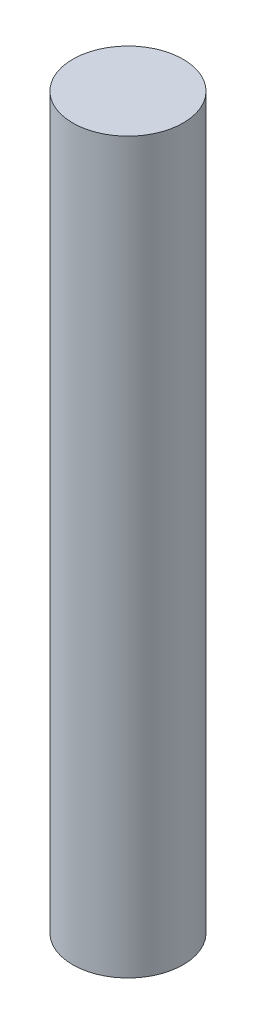
ISO-10303-21;
HEADER;
FILE_DESCRIPTION(('STEP AP214'),'2;1');
FILE_NAME('part.step','',(''),(''),'','','');
FILE_SCHEMA(('AUTOMOTIVE_DESIGN { 1 0 10303 214 1 1 1 1 }'));
ENDSEC;
DATA;
#1=APPLICATION_CONTEXT('core data for automotive mechanical design processes');
#2=APPLICATION_PROTOCOL_DEFINITION('international standard','automotive_design',2000,#1);
#3=PRODUCT_CONTEXT('',#1,'mechanical');
#4=PRODUCT('Part','Part','',(#3));
#5=PRODUCT_RELATED_PRODUCT_CATEGORY('part','',(#4));
#6=PRODUCT_DEFINITION_FORMATION('','',#4);
#7=PRODUCT_DEFINITION_CONTEXT('part definition',#1,'design');
#8=PRODUCT_DEFINITION('design','',#6,#7);
#9=PRODUCT_DEFINITION_SHAPE('','',#8);
#10=(LENGTH_UNIT() NAMED_UNIT(*) SI_UNIT(.MILLI.,.METRE.));
#11=(NAMED_UNIT(*) PLANE_ANGLE_UNIT() SI_UNIT($,.RADIAN.));
#12=(NAMED_UNIT(*) SI_UNIT($,.STERADIAN.) SOLID_ANGLE_UNIT());
#13=UNCERTAINTY_MEASURE_WITH_UNIT(LENGTH_MEASURE(1.E-05),#10,'distance_accuracy_value','');
#14=(GEOMETRIC_REPRESENTATION_CONTEXT(3) GLOBAL_UNCERTAINTY_ASSIGNED_CONTEXT((#13)) GLOBAL_UNIT_ASSIGNED_CONTEXT((#10,
#11,#12)) REPRESENTATION_CONTEXT('',''));
#15=CARTESIAN_POINT('',(0.,0.,0.));
#16=DIRECTION('',(0.,0.,1.));
#17=DIRECTION('',(1.,0.,0.));
#18=AXIS2_PLACEMENT_3D('',#15,#16,#17);
#19=CARTESIAN_POINT('',(0.,330.,0.));
#20=DIRECTION('',(0.,-1.,0.));
#21=DIRECTION('',(0.,0.,-1.));
#22=AXIS2_PLACEMENT_3D('',#19,#20,#21);
#23=CYLINDRICAL_SURFACE('',#22,25.);
#24=CARTESIAN_POINT('',(0.,330.,0.));
#25=DIRECTION('',(0.,1.,0.));
#26=DIRECTION('',(0.,0.,1.));
#27=AXIS2_PLACEMENT_3D('',#24,#25,#26);
#28=CIRCLE('',#27,25.);
#29=CARTESIAN_POINT('',(0.,330.,25.));
#30=VERTEX_POINT('',#29);
#31=EDGE_CURVE('E10',#30,#30,#28,.T.);
#32=ORIENTED_EDGE('',*,*,#31,.F.);
#33=EDGE_LOOP('',(#32));
#34=FACE_BOUND('',#33,.T.);
#35=CARTESIAN_POINT('',(0.,0.,0.));
#36=DIRECTION('',(0.,1.,0.));
#37=DIRECTION('',(0.,0.,1.));
#38=AXIS2_PLACEMENT_3D('',#35,#36,#37);
#39=CIRCLE('',#38,25.);
#40=CARTESIAN_POINT('',(0.,0.,25.));
#41=VERTEX_POINT('',#40);
#42=EDGE_CURVE('E38',#41,#41,#39,.T.);
#43=ORIENTED_EDGE('',*,*,#42,.T.);
#44=EDGE_LOOP('',(#43));
#45=FACE_BOUND('',#44,.T.);
#46=ADVANCED_FACE('F35',(#34,#45),#23,.T.);
#47=CARTESIAN_POINT('',(0.,330.,0.));
#48=DIRECTION('',(0.,1.,0.));
#49=DIRECTION('',(0.,0.,1.));
#50=AXIS2_PLACEMENT_3D('',#47,#48,#49);
#51=PLANE('',#50);
#52=ORIENTED_EDGE('',*,*,#31,.T.);
#53=EDGE_LOOP('',(#52));
#54=FACE_BOUND('',#53,.T.);
#55=ADVANCED_FACE('F51',(#54),#51,.T.);
#56=CARTESIAN_POINT('',(0.,0.,0.));
#57=DIRECTION('',(0.,1.,0.));
#58=DIRECTION('',(0.,0.,1.));
#59=AXIS2_PLACEMENT_3D('',#56,#57,#58);
#60=PLANE('',#59);
#61=ORIENTED_EDGE('',*,*,#42,.F.);
#62=EDGE_LOOP('',(#61));
#63=FACE_BOUND('',#62,.T.);
#64=ADVANCED_FACE('F49',(#63),#60,.F.);
#65=CLOSED_SHELL('',(#46,#55,#64));
#66=MANIFOLD_SOLID_BREP('B2',#65);
#67=ADVANCED_BREP_SHAPE_REPRESENTATION('',(#18,#66),#14);
#68=SHAPE_DEFINITION_REPRESENTATION(#9,#67);
ENDSEC;
END-ISO-10303-21;
